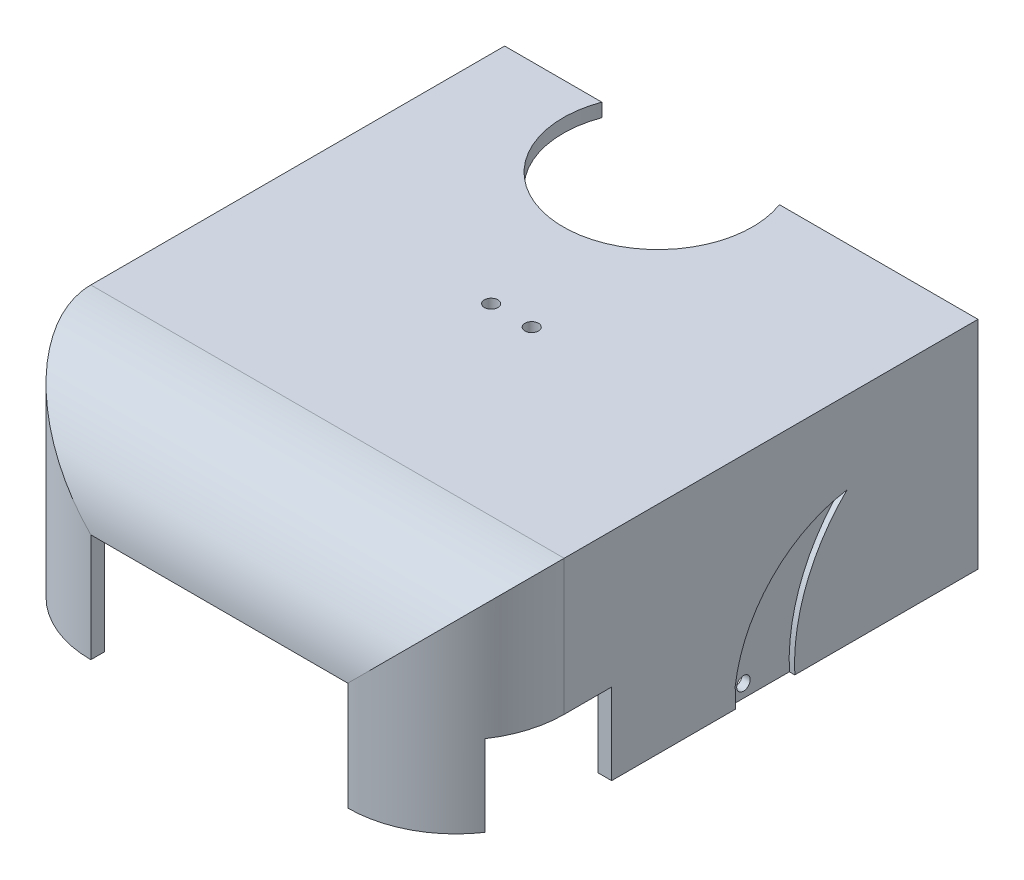
ISO-10303-21;
HEADER;
FILE_DESCRIPTION(('STEP AP214'),'2;1');
FILE_NAME('part.step','',(''),(''),'','','');
FILE_SCHEMA(('AUTOMOTIVE_DESIGN { 1 0 10303 214 1 1 1 1 }'));
ENDSEC;
DATA;
#1=APPLICATION_CONTEXT('core data for automotive mechanical design processes');
#2=APPLICATION_PROTOCOL_DEFINITION('international standard','automotive_design',2000,#1);
#3=PRODUCT_CONTEXT('',#1,'mechanical');
#4=PRODUCT('Part','Part','',(#3));
#5=PRODUCT_RELATED_PRODUCT_CATEGORY('part','',(#4));
#6=PRODUCT_DEFINITION_FORMATION('','',#4);
#7=PRODUCT_DEFINITION_CONTEXT('part definition',#1,'design');
#8=PRODUCT_DEFINITION('design','',#6,#7);
#9=PRODUCT_DEFINITION_SHAPE('','',#8);
#10=(LENGTH_UNIT() NAMED_UNIT(*) SI_UNIT(.MILLI.,.METRE.));
#11=(NAMED_UNIT(*) PLANE_ANGLE_UNIT() SI_UNIT($,.RADIAN.));
#12=(NAMED_UNIT(*) SI_UNIT($,.STERADIAN.) SOLID_ANGLE_UNIT());
#13=UNCERTAINTY_MEASURE_WITH_UNIT(LENGTH_MEASURE(1.E-05),#10,'distance_accuracy_value','');
#14=(GEOMETRIC_REPRESENTATION_CONTEXT(3) GLOBAL_UNCERTAINTY_ASSIGNED_CONTEXT((#13)) GLOBAL_UNIT_ASSIGNED_CONTEXT((#10,
#11,#12)) REPRESENTATION_CONTEXT('',''));
#15=CARTESIAN_POINT('',(0.,0.,0.));
#16=DIRECTION('',(0.,0.,1.));
#17=DIRECTION('',(1.,0.,0.));
#18=AXIS2_PLACEMENT_3D('',#15,#16,#17);
#19=CARTESIAN_POINT('',(87.5,-80.,193.));
#20=DIRECTION('',(-1.,0.,0.));
#21=DIRECTION('',(0.,0.,1.));
#22=AXIS2_PLACEMENT_3D('',#19,#20,#21);
#23=PLANE('',#22);
#24=CARTESIAN_POINT('',(87.5,3.51978458868363,3.39554748014627));
#25=DIRECTION('',(1.,0.,0.));
#26=DIRECTION('',(0.,0.,-1.));
#27=AXIS2_PLACEMENT_3D('',#24,#25,#26);
#28=CIRCLE('',#27,64.4295026280098);
#29=CARTESIAN_POINT('',(87.5,49.5892121244553,48.4374019648253));
#30=VERTEX_POINT('',#29);
#31=CARTESIAN_POINT('',(87.5,0.,67.7288353282113));
#32=VERTEX_POINT('',#31);
#33=EDGE_CURVE('E248',#30,#32,#28,.T.);
#34=ORIENTED_EDGE('',*,*,#33,.T.);
#35=DIRECTION('',(0.,0.,-1.));
#36=VECTOR('',#35,1.);
#37=CARTESIAN_POINT('',(87.5,0.,193.));
#38=LINE('',#37,#36);
#39=CARTESIAN_POINT('',(87.5,0.,0.));
#40=VERTEX_POINT('',#39);
#41=EDGE_CURVE('E356',#32,#40,#38,.T.);
#42=ORIENTED_EDGE('',*,*,#41,.T.);
#43=DIRECTION('',(0.,1.,0.));
#44=VECTOR('',#43,1.);
#45=CARTESIAN_POINT('',(87.5,-80.,0.));
#46=LINE('',#45,#44);
#47=CARTESIAN_POINT('',(87.5,80.,0.));
#48=VERTEX_POINT('',#47);
#49=EDGE_CURVE('E478',#40,#48,#46,.T.);
#50=ORIENTED_EDGE('',*,*,#49,.T.);
#51=DIRECTION('',(0.,0.,-1.));
#52=VECTOR('',#51,1.);
#53=CARTESIAN_POINT('',(87.5,80.,193.));
#54=LINE('',#53,#52);
#55=CARTESIAN_POINT('',(87.5,80.,153.));
#56=VERTEX_POINT('',#55);
#57=EDGE_CURVE('E495',#56,#48,#54,.T.);
#58=ORIENTED_EDGE('',*,*,#57,.F.);
#59=DIRECTION('',(0.,1.,0.));
#60=VECTOR('',#59,1.);
#61=CARTESIAN_POINT('',(87.5,-80.,153.));
#62=LINE('',#61,#60);
#63=CARTESIAN_POINT('',(87.5,30.,153.));
#64=VERTEX_POINT('',#63);
#65=EDGE_CURVE('E510',#56,#64,#62,.F.);
#66=ORIENTED_EDGE('',*,*,#65,.T.);
#67=DIRECTION('',(0.,0.,-1.));
#68=VECTOR('',#67,1.);
#69=CARTESIAN_POINT('',(87.5,30.,193.));
#70=LINE('',#69,#68);
#71=CARTESIAN_POINT('',(87.5,30.,135.457670656423));
#72=VERTEX_POINT('',#71);
#73=EDGE_CURVE('E397',#64,#72,#70,.T.);
#74=ORIENTED_EDGE('',*,*,#73,.T.);
#75=DIRECTION('',(0.,-1.,0.));
#76=VECTOR('',#75,1.);
#77=CARTESIAN_POINT('',(87.5,-80.,135.457670656423));
#78=LINE('',#77,#76);
#79=CARTESIAN_POINT('',(87.5,0.,135.457670656423));
#80=VERTEX_POINT('',#79);
#81=EDGE_CURVE('E405',#72,#80,#78,.T.);
#82=ORIENTED_EDGE('',*,*,#81,.T.);
#83=CARTESIAN_POINT('',(87.5,0.,89.7288353282113));
#84=VERTEX_POINT('',#83);
#85=EDGE_CURVE('E357',#80,#84,#38,.T.);
#86=ORIENTED_EDGE('',*,*,#85,.T.);
#87=DIRECTION('',(0.,0.999043315977412,-0.0437315995689179));
#88=VECTOR('',#87,1.);
#89=CARTESIAN_POINT('',(87.5,0.,89.7288353282113));
#90=LINE('',#89,#88);
#91=CARTESIAN_POINT('',(87.5,2.29557496399044,89.6283500304267));
#92=VERTEX_POINT('',#91);
#93=EDGE_CURVE('E631',#84,#92,#90,.T.);
#94=ORIENTED_EDGE('',*,*,#93,.T.);
#95=DIRECTION('',(0.,-0.999602780590757,-0.0281829919495297));
#96=VECTOR('',#95,1.);
#97=CARTESIAN_POINT('',(87.5,7.29358886694422,89.7692649901744));
#98=LINE('',#97,#96);
#99=CARTESIAN_POINT('',(87.5,7.29358886694422,89.7692649901744));
#100=VERTEX_POINT('',#99);
#101=EDGE_CURVE('E244',#100,#92,#98,.T.);
#102=ORIENTED_EDGE('',*,*,#101,.F.);
#103=CARTESIAN_POINT('',(87.5,0.973763055425838,40.9952163999991));
#104=DIRECTION('',(-1.,0.,0.));
#105=DIRECTION('',(0.,0.,1.));
#106=AXIS2_PLACEMENT_3D('',#103,#104,#105);
#107=CIRCLE('',#106,49.1817853901697);
#108=EDGE_CURVE('E650',#100,#30,#107,.T.);
#109=ORIENTED_EDGE('',*,*,#108,.T.);
#110=EDGE_LOOP('',(#34,#42,#50,#58,#66,#74,#82,#86,#94,#102,#109));
#111=FACE_BOUND('',#110,.T.);
#112=ADVANCED_FACE('F45',(#111),#23,.F.);
#113=CARTESIAN_POINT('',(0.,0.,0.));
#114=DIRECTION('',(0.,1.,0.));
#115=DIRECTION('',(0.,0.,1.));
#116=AXIS2_PLACEMENT_3D('',#113,#114,#115);
#117=PLANE('',#116);
#118=DIRECTION('',(1.,0.,0.));
#119=VECTOR('',#118,1.);
#120=CARTESIAN_POINT('',(85.5,0.,67.7288353282113));
#121=LINE('',#120,#119);
#122=CARTESIAN_POINT('',(85.5,0.,67.7288353282113));
#123=VERTEX_POINT('',#122);
#124=EDGE_CURVE('E251',#123,#32,#121,.T.);
#125=ORIENTED_EDGE('',*,*,#124,.F.);
#126=DIRECTION('',(0.,0.,1.));
#127=VECTOR('',#126,1.);
#128=CARTESIAN_POINT('',(85.5,0.,67.7288353282113));
#129=LINE('',#128,#127);
#130=CARTESIAN_POINT('',(85.5,0.,89.7288353282113));
#131=VERTEX_POINT('',#130);
#132=EDGE_CURVE('E230',#123,#131,#129,.T.);
#133=ORIENTED_EDGE('',*,*,#132,.T.);
#134=DIRECTION('',(1.,0.,0.));
#135=VECTOR('',#134,1.);
#136=CARTESIAN_POINT('',(85.5,0.,89.7288353282113));
#137=LINE('',#136,#135);
#138=EDGE_CURVE('E258',#131,#84,#137,.T.);
#139=ORIENTED_EDGE('',*,*,#138,.T.);
#140=ORIENTED_EDGE('',*,*,#85,.F.);
#141=DIRECTION('',(1.,0.,0.));
#142=VECTOR('',#141,1.);
#143=CARTESIAN_POINT('',(70.,0.,135.457670656423));
#144=LINE('',#143,#142);
#145=CARTESIAN_POINT('',(82.5,0.,135.457670656423));
#146=VERTEX_POINT('',#145);
#147=EDGE_CURVE('E349',#146,#80,#144,.T.);
#148=ORIENTED_EDGE('',*,*,#147,.F.);
#149=DIRECTION('',(0.,0.,-1.));
#150=VECTOR('',#149,1.);
#151=CARTESIAN_POINT('',(82.5,0.,193.));
#152=LINE('',#151,#150);
#153=CARTESIAN_POINT('',(82.5,0.,0.));
#154=VERTEX_POINT('',#153);
#155=EDGE_CURVE('E353',#146,#154,#152,.T.);
#156=ORIENTED_EDGE('',*,*,#155,.T.);
#157=DIRECTION('',(-1.,0.,0.));
#158=VECTOR('',#157,1.);
#159=CARTESIAN_POINT('',(110.,0.,0.));
#160=LINE('',#159,#158);
#161=EDGE_CURVE('E337',#40,#154,#160,.T.);
#162=ORIENTED_EDGE('',*,*,#161,.F.);
#163=ORIENTED_EDGE('',*,*,#41,.F.);
#164=EDGE_LOOP('',(#125,#133,#139,#140,#148,#156,#162,#163));
#165=FACE_BOUND('',#164,.T.);
#166=ADVANCED_FACE('F633',(#165),#117,.F.);
#167=DIRECTION('',(0.,0.,1.));
#168=VECTOR('',#167,1.);
#169=CARTESIAN_POINT('',(-87.5,0.,193.));
#170=LINE('',#169,#168);
#171=CARTESIAN_POINT('',(-87.5,0.,85.));
#172=VERTEX_POINT('',#171);
#173=CARTESIAN_POINT('',(-87.5,0.,153.));
#174=VERTEX_POINT('',#173);
#175=EDGE_CURVE('E378',#172,#174,#170,.T.);
#176=ORIENTED_EDGE('',*,*,#175,.F.);
#177=DIRECTION('',(1.,0.,0.));
#178=VECTOR('',#177,1.);
#179=CARTESIAN_POINT('',(0.,0.,85.));
#180=LINE('',#179,#178);
#181=CARTESIAN_POINT('',(-82.5,0.,85.));
#182=VERTEX_POINT('',#181);
#183=EDGE_CURVE('E11',#172,#182,#180,.T.);
#184=ORIENTED_EDGE('',*,*,#183,.T.);
#185=DIRECTION('',(0.,0.,1.));
#186=VECTOR('',#185,1.);
#187=CARTESIAN_POINT('',(-82.5,0.,193.));
#188=LINE('',#187,#186);
#189=CARTESIAN_POINT('',(-82.5,0.,153.));
#190=VERTEX_POINT('',#189);
#191=EDGE_CURVE('E369',#182,#190,#188,.T.);
#192=ORIENTED_EDGE('',*,*,#191,.T.);
#193=CARTESIAN_POINT('',(-47.5,0.,153.));
#194=DIRECTION('',(0.,1.,0.));
#195=DIRECTION('',(0.,0.,1.));
#196=AXIS2_PLACEMENT_3D('',#193,#194,#195);
#197=CIRCLE('',#196,35.);
#198=CARTESIAN_POINT('',(-47.5,0.,188.));
#199=VERTEX_POINT('',#198);
#200=EDGE_CURVE('E365',#199,#190,#197,.F.);
#201=ORIENTED_EDGE('',*,*,#200,.F.);
#202=DIRECTION('',(0.,0.,-1.));
#203=VECTOR('',#202,1.);
#204=CARTESIAN_POINT('',(-47.5,0.,183.));
#205=LINE('',#204,#203);
#206=CARTESIAN_POINT('',(-47.5,0.,193.));
#207=VERTEX_POINT('',#206);
#208=EDGE_CURVE('E361',#207,#199,#205,.T.);
#209=ORIENTED_EDGE('',*,*,#208,.F.);
#210=CARTESIAN_POINT('',(-47.5,0.,153.));
#211=DIRECTION('',(0.,1.,0.));
#212=DIRECTION('',(0.,0.,1.));
#213=AXIS2_PLACEMENT_3D('',#210,#211,#212);
#214=CIRCLE('',#213,40.);
#215=EDGE_CURVE('E374',#207,#174,#214,.F.);
#216=ORIENTED_EDGE('',*,*,#215,.T.);
#217=EDGE_LOOP('',(#176,#184,#192,#201,#209,#216));
#218=FACE_BOUND('',#217,.T.);
#219=ADVANCED_FACE('F568',(#218),#117,.F.);
#220=CARTESIAN_POINT('',(0.,0.,0.));
#221=DIRECTION('',(0.,0.,-1.));
#222=DIRECTION('',(-1.,0.,0.));
#223=AXIS2_PLACEMENT_3D('',#220,#221,#222);
#224=PLANE('',#223);
#225=CARTESIAN_POINT('',(-82.5,0.,0.));
#226=VERTEX_POINT('',#225);
#227=CARTESIAN_POINT('',(-87.5,0.,0.));
#228=VERTEX_POINT('',#227);
#229=EDGE_CURVE('E322',#226,#228,#160,.T.);
#230=ORIENTED_EDGE('',*,*,#229,.T.);
#231=DIRECTION('',(0.,-1.,0.));
#232=VECTOR('',#231,1.);
#233=CARTESIAN_POINT('',(-87.5,-80.,0.));
#234=LINE('',#233,#232);
#235=CARTESIAN_POINT('',(-87.5,80.,0.));
#236=VERTEX_POINT('',#235);
#237=EDGE_CURVE('E487',#236,#228,#234,.T.);
#238=ORIENTED_EDGE('',*,*,#237,.F.);
#239=DIRECTION('',(-1.,0.,0.));
#240=VECTOR('',#239,1.);
#241=CARTESIAN_POINT('',(-87.5,80.,0.));
#242=LINE('',#241,#240);
#243=CARTESIAN_POINT('',(-51.5907616385491,80.,0.));
#244=VERTEX_POINT('',#243);
#245=EDGE_CURVE('E481',#244,#236,#242,.T.);
#246=ORIENTED_EDGE('',*,*,#245,.F.);
#247=DIRECTION('',(0.,1.,0.));
#248=VECTOR('',#247,1.);
#249=CARTESIAN_POINT('',(-51.5907616385491,-80.,0.));
#250=LINE('',#249,#248);
#251=CARTESIAN_POINT('',(-51.5907616385491,75.,0.));
#252=VERTEX_POINT('',#251);
#253=EDGE_CURVE('E416',#252,#244,#250,.T.);
#254=ORIENTED_EDGE('',*,*,#253,.F.);
#255=DIRECTION('',(-1.,0.,0.));
#256=VECTOR('',#255,1.);
#257=CARTESIAN_POINT('',(0.,75.,0.));
#258=LINE('',#257,#256);
#259=CARTESIAN_POINT('',(-82.5,75.,0.));
#260=VERTEX_POINT('',#259);
#261=EDGE_CURVE('E470',#252,#260,#258,.T.);
#262=ORIENTED_EDGE('',*,*,#261,.T.);
#263=DIRECTION('',(0.,-1.,0.));
#264=VECTOR('',#263,1.);
#265=CARTESIAN_POINT('',(-82.5,0.,0.));
#266=LINE('',#265,#264);
#267=EDGE_CURVE('E444',#260,#226,#266,.T.);
#268=ORIENTED_EDGE('',*,*,#267,.T.);
#269=EDGE_LOOP('',(#230,#238,#246,#254,#262,#268));
#270=FACE_BOUND('',#269,.T.);
#271=ADVANCED_FACE('F553',(#270),#224,.T.);
#272=ORIENTED_EDGE('',*,*,#161,.T.);
#273=DIRECTION('',(0.,1.,0.));
#274=VECTOR('',#273,1.);
#275=CARTESIAN_POINT('',(82.5,0.,0.));
#276=LINE('',#275,#274);
#277=CARTESIAN_POINT('',(82.5,75.,0.));
#278=VERTEX_POINT('',#277);
#279=EDGE_CURVE('E455',#154,#278,#276,.T.);
#280=ORIENTED_EDGE('',*,*,#279,.T.);
#281=CARTESIAN_POINT('',(14.0907616385492,75.,0.));
#282=VERTEX_POINT('',#281);
#283=EDGE_CURVE('E474',#278,#282,#258,.T.);
#284=ORIENTED_EDGE('',*,*,#283,.T.);
#285=DIRECTION('',(0.,1.,0.));
#286=VECTOR('',#285,1.);
#287=CARTESIAN_POINT('',(14.0907616385492,-80.,0.));
#288=LINE('',#287,#286);
#289=CARTESIAN_POINT('',(14.0907616385492,80.,0.));
#290=VERTEX_POINT('',#289);
#291=EDGE_CURVE('E413',#290,#282,#288,.F.);
#292=ORIENTED_EDGE('',*,*,#291,.F.);
#293=EDGE_CURVE('E483',#48,#290,#242,.T.);
#294=ORIENTED_EDGE('',*,*,#293,.F.);
#295=ORIENTED_EDGE('',*,*,#49,.F.);
#296=EDGE_LOOP('',(#272,#280,#284,#292,#294,#295));
#297=FACE_BOUND('',#296,.T.);
#298=ADVANCED_FACE('F581',(#297),#224,.T.);
#299=CARTESIAN_POINT('',(-87.5,80.,193.));
#300=DIRECTION('',(0.,-1.,0.));
#301=DIRECTION('',(0.,0.,-1.));
#302=AXIS2_PLACEMENT_3D('',#299,#300,#301);
#303=PLANE('',#302);
#304=CARTESIAN_POINT('',(7.5,80.,85.));
#305=DIRECTION('',(0.,1.,0.));
#306=DIRECTION('',(0.,0.,1.));
#307=AXIS2_PLACEMENT_3D('',#304,#305,#306);
#308=CIRCLE('',#307,2.5);
#309=CARTESIAN_POINT('',(7.5,80.,87.5));
#310=VERTEX_POINT('',#309);
#311=EDGE_CURVE('E323',#310,#310,#308,.T.);
#312=ORIENTED_EDGE('',*,*,#311,.F.);
#313=EDGE_LOOP('',(#312));
#314=FACE_BOUND('',#313,.T.);
#315=CARTESIAN_POINT('',(-7.5,80.,85.));
#316=DIRECTION('',(0.,1.,0.));
#317=DIRECTION('',(0.,0.,1.));
#318=AXIS2_PLACEMENT_3D('',#315,#316,#317);
#319=CIRCLE('',#318,2.5);
#320=CARTESIAN_POINT('',(-7.5,80.,87.5));
#321=VERTEX_POINT('',#320);
#322=EDGE_CURVE('E327',#321,#321,#319,.T.);
#323=ORIENTED_EDGE('',*,*,#322,.F.);
#324=EDGE_LOOP('',(#323));
#325=FACE_BOUND('',#324,.T.);
#326=ORIENTED_EDGE('',*,*,#293,.T.);
#327=CARTESIAN_POINT('',(-18.75,80.,12.1030729568982));
#328=DIRECTION('',(0.,1.,0.));
#329=DIRECTION('',(0.,0.,1.));
#330=AXIS2_PLACEMENT_3D('',#327,#328,#329);
#331=CIRCLE('',#330,35.);
#332=EDGE_CURVE('E409',#244,#290,#331,.T.);
#333=ORIENTED_EDGE('',*,*,#332,.F.);
#334=ORIENTED_EDGE('',*,*,#245,.T.);
#335=DIRECTION('',(0.,0.,-1.));
#336=VECTOR('',#335,1.);
#337=CARTESIAN_POINT('',(-87.5,80.,193.));
#338=LINE('',#337,#336);
#339=CARTESIAN_POINT('',(-87.5,80.,153.));
#340=VERTEX_POINT('',#339);
#341=EDGE_CURVE('E491',#340,#236,#338,.T.);
#342=ORIENTED_EDGE('',*,*,#341,.F.);
#343=DIRECTION('',(-1.,0.,0.));
#344=VECTOR('',#343,1.);
#345=CARTESIAN_POINT('',(-87.5,80.,153.));
#346=LINE('',#345,#344);
#347=EDGE_CURVE('E514',#340,#56,#346,.F.);
#348=ORIENTED_EDGE('',*,*,#347,.T.);
#349=ORIENTED_EDGE('',*,*,#57,.T.);
#350=EDGE_LOOP('',(#326,#333,#334,#342,#348,#349));
#351=FACE_BOUND('',#350,.T.);
#352=ADVANCED_FACE('F603',(#314,#325,#351),#303,.F.);
#353=CARTESIAN_POINT('',(-87.5,-80.,193.));
#354=DIRECTION('',(1.,0.,0.));
#355=DIRECTION('',(0.,0.,-1.));
#356=AXIS2_PLACEMENT_3D('',#353,#354,#355);
#357=PLANE('',#356);
#358=CARTESIAN_POINT('',(-87.5,40.,130.));
#359=DIRECTION('',(-1.,0.,0.));
#360=DIRECTION('',(0.,0.,1.));
#361=AXIS2_PLACEMENT_3D('',#358,#359,#360);
#362=CIRCLE('',#361,2.5);
#363=CARTESIAN_POINT('',(-87.5,40.,132.5));
#364=VERTEX_POINT('',#363);
#365=EDGE_CURVE('E279',#364,#364,#362,.T.);
#366=ORIENTED_EDGE('',*,*,#365,.F.);
#367=EDGE_LOOP('',(#366));
#368=FACE_BOUND('',#367,.T.);
#369=CARTESIAN_POINT('',(-87.5,40.,142.5));
#370=DIRECTION('',(-1.,0.,0.));
#371=DIRECTION('',(0.,0.,1.));
#372=AXIS2_PLACEMENT_3D('',#369,#370,#371);
#373=CIRCLE('',#372,2.5);
#374=CARTESIAN_POINT('',(-87.5,40.,145.));
#375=VERTEX_POINT('',#374);
#376=EDGE_CURVE('E299',#375,#375,#373,.T.);
#377=ORIENTED_EDGE('',*,*,#376,.F.);
#378=EDGE_LOOP('',(#377));
#379=FACE_BOUND('',#378,.T.);
#380=CARTESIAN_POINT('',(-87.5,25.,70.));
#381=DIRECTION('',(-1.,0.,0.));
#382=DIRECTION('',(0.,0.,1.));
#383=AXIS2_PLACEMENT_3D('',#380,#381,#382);
#384=CIRCLE('',#383,2.5);
#385=CARTESIAN_POINT('',(-87.5,25.,72.5));
#386=VERTEX_POINT('',#385);
#387=EDGE_CURVE('E307',#386,#386,#384,.T.);
#388=ORIENTED_EDGE('',*,*,#387,.F.);
#389=EDGE_LOOP('',(#388));
#390=FACE_BOUND('',#389,.T.);
#391=CARTESIAN_POINT('',(-87.5,25.,95.));
#392=DIRECTION('',(-1.,0.,0.));
#393=DIRECTION('',(0.,0.,1.));
#394=AXIS2_PLACEMENT_3D('',#391,#392,#393);
#395=CIRCLE('',#394,2.50000000000001);
#396=CARTESIAN_POINT('',(-87.5,25.,97.5));
#397=VERTEX_POINT('',#396);
#398=EDGE_CURVE('E256',#397,#397,#395,.T.);
#399=ORIENTED_EDGE('',*,*,#398,.F.);
#400=EDGE_LOOP('',(#399));
#401=FACE_BOUND('',#400,.T.);
#402=DIRECTION('',(0.,0.,-1.));
#403=VECTOR('',#402,1.);
#404=CARTESIAN_POINT('',(-87.5,20.,85.));
#405=LINE('',#404,#403);
#406=CARTESIAN_POINT('',(-87.5,20.,85.));
#407=VERTEX_POINT('',#406);
#408=CARTESIAN_POINT('',(-87.5,20.,65.));
#409=VERTEX_POINT('',#408);
#410=EDGE_CURVE('E267',#407,#409,#405,.T.);
#411=ORIENTED_EDGE('',*,*,#410,.F.);
#412=DIRECTION('',(0.,1.,0.));
#413=VECTOR('',#412,1.);
#414=CARTESIAN_POINT('',(-87.5,-10.,85.));
#415=LINE('',#414,#413);
#416=EDGE_CURVE('E278',#172,#407,#415,.T.);
#417=ORIENTED_EDGE('',*,*,#416,.F.);
#418=ORIENTED_EDGE('',*,*,#175,.T.);
#419=DIRECTION('',(0.,-1.,0.));
#420=VECTOR('',#419,1.);
#421=CARTESIAN_POINT('',(-87.5,-80.,153.));
#422=LINE('',#421,#420);
#423=EDGE_CURVE('E517',#174,#340,#422,.F.);
#424=ORIENTED_EDGE('',*,*,#423,.T.);
#425=ORIENTED_EDGE('',*,*,#341,.T.);
#426=ORIENTED_EDGE('',*,*,#237,.T.);
#427=CARTESIAN_POINT('',(-87.5,0.,65.));
#428=VERTEX_POINT('',#427);
#429=EDGE_CURVE('E379',#228,#428,#170,.T.);
#430=ORIENTED_EDGE('',*,*,#429,.T.);
#431=DIRECTION('',(0.,-1.,0.));
#432=VECTOR('',#431,1.);
#433=CARTESIAN_POINT('',(-87.5,0.,65.));
#434=LINE('',#433,#432);
#435=EDGE_CURVE('E69',#409,#428,#434,.T.);
#436=ORIENTED_EDGE('',*,*,#435,.F.);
#437=EDGE_LOOP('',(#411,#417,#418,#424,#425,#426,#430,#436));
#438=FACE_BOUND('',#437,.T.);
#439=ADVANCED_FACE('F548',(#368,#379,#390,#401,#438),#357,.F.);
#440=CARTESIAN_POINT('',(0.,40.,153.));
#441=DIRECTION('',(-1.,0.,0.));
#442=DIRECTION('',(0.,0.,1.));
#443=AXIS2_PLACEMENT_3D('',#440,#441,#442);
#444=CYLINDRICAL_SURFACE('',#443,40.);
#445=CARTESIAN_POINT('',(47.5,40.,153.));
#446=DIRECTION('',(-0.707106781186547,0.707106781186547,0.));
#447=DIRECTION('',(-0.707106781186547,-0.707106781186547,0.));
#448=AXIS2_PLACEMENT_3D('',#445,#446,#447);
#449=ELLIPSE('',#448,56.5685424949238,40.);
#450=CARTESIAN_POINT('',(47.5,40.,193.));
#451=VERTEX_POINT('',#450);
#452=EDGE_CURVE('E450',#56,#451,#449,.F.);
#453=ORIENTED_EDGE('',*,*,#452,.F.);
#454=ORIENTED_EDGE('',*,*,#347,.F.);
#455=CARTESIAN_POINT('',(-47.5,40.,153.));
#456=DIRECTION('',(-0.707106781186547,-0.707106781186547,0.));
#457=DIRECTION('',(0.707106781186547,-0.707106781186547,0.));
#458=AXIS2_PLACEMENT_3D('',#455,#456,#457);
#459=ELLIPSE('',#458,56.5685424949238,40.);
#460=CARTESIAN_POINT('',(-47.5,40.,193.));
#461=VERTEX_POINT('',#460);
#462=EDGE_CURVE('E482',#461,#340,#459,.T.);
#463=ORIENTED_EDGE('',*,*,#462,.F.);
#464=DIRECTION('',(-1.,0.,0.));
#465=VECTOR('',#464,1.);
#466=CARTESIAN_POINT('',(0.,40.,193.));
#467=LINE('',#466,#465);
#468=EDGE_CURVE('E503',#451,#461,#467,.T.);
#469=ORIENTED_EDGE('',*,*,#468,.F.);
#470=EDGE_LOOP('',(#453,#454,#463,#469));
#471=FACE_BOUND('',#470,.T.);
#472=ADVANCED_FACE('F47',(#471),#444,.T.);
#473=CARTESIAN_POINT('',(-47.5,0.,153.));
#474=DIRECTION('',(0.,-1.,0.));
#475=DIRECTION('',(0.,0.,-1.));
#476=AXIS2_PLACEMENT_3D('',#473,#474,#475);
#477=CYLINDRICAL_SURFACE('',#476,40.);
#478=ORIENTED_EDGE('',*,*,#215,.F.);
#479=DIRECTION('',(0.,-1.,0.));
#480=VECTOR('',#479,1.);
#481=CARTESIAN_POINT('',(-47.5,0.,193.));
#482=LINE('',#481,#480);
#483=EDGE_CURVE('E499',#461,#207,#482,.T.);
#484=ORIENTED_EDGE('',*,*,#483,.F.);
#485=ORIENTED_EDGE('',*,*,#462,.T.);
#486=ORIENTED_EDGE('',*,*,#423,.F.);
#487=EDGE_LOOP('',(#478,#484,#485,#486));
#488=FACE_BOUND('',#487,.T.);
#489=ADVANCED_FACE('F694',(#488),#477,.T.);
#490=CARTESIAN_POINT('',(47.5,0.,153.));
#491=DIRECTION('',(0.,1.,0.));
#492=DIRECTION('',(0.,0.,1.));
#493=AXIS2_PLACEMENT_3D('',#490,#491,#492);
#494=CYLINDRICAL_SURFACE('',#493,40.);
#495=CARTESIAN_POINT('',(47.5,0.,153.));
#496=DIRECTION('',(0.,1.,0.));
#497=DIRECTION('',(0.,0.,1.));
#498=AXIS2_PLACEMENT_3D('',#495,#496,#497);
#499=CIRCLE('',#498,40.);
#500=CARTESIAN_POINT('',(80.6006499737944,0.,175.457670656423));
#501=VERTEX_POINT('',#500);
#502=CARTESIAN_POINT('',(47.5,0.,193.));
#503=VERTEX_POINT('',#502);
#504=EDGE_CURVE('E342',#501,#503,#499,.F.);
#505=ORIENTED_EDGE('',*,*,#504,.F.);
#506=DIRECTION('',(0.,1.,0.));
#507=VECTOR('',#506,1.);
#508=CARTESIAN_POINT('',(80.6006499737944,0.,175.457670656423));
#509=LINE('',#508,#507);
#510=CARTESIAN_POINT('',(80.6006499737944,30.,175.457670656423));
#511=VERTEX_POINT('',#510);
#512=EDGE_CURVE('E401',#511,#501,#509,.F.);
#513=ORIENTED_EDGE('',*,*,#512,.F.);
#514=CARTESIAN_POINT('',(47.5,30.,153.));
#515=DIRECTION('',(0.,1.,0.));
#516=DIRECTION('',(0.,0.,1.));
#517=AXIS2_PLACEMENT_3D('',#514,#515,#516);
#518=CIRCLE('',#517,40.);
#519=EDGE_CURVE('E394',#64,#511,#518,.F.);
#520=ORIENTED_EDGE('',*,*,#519,.F.);
#521=ORIENTED_EDGE('',*,*,#65,.F.);
#522=ORIENTED_EDGE('',*,*,#452,.T.);
#523=DIRECTION('',(0.,1.,0.));
#524=VECTOR('',#523,1.);
#525=CARTESIAN_POINT('',(47.5,0.,193.));
#526=LINE('',#525,#524);
#527=EDGE_CURVE('E507',#503,#451,#526,.T.);
#528=ORIENTED_EDGE('',*,*,#527,.F.);
#529=EDGE_LOOP('',(#505,#513,#520,#521,#522,#528));
#530=FACE_BOUND('',#529,.T.);
#531=ADVANCED_FACE('F616',(#530),#494,.T.);
#532=CARTESIAN_POINT('',(82.5,-80.,193.));
#533=DIRECTION('',(-1.,0.,0.));
#534=DIRECTION('',(0.,0.,1.));
#535=AXIS2_PLACEMENT_3D('',#532,#533,#534);
#536=PLANE('',#535);
#537=CARTESIAN_POINT('',(82.5,4.79458191546733,84.6988075103005));
#538=DIRECTION('',(-1.,0.,0.));
#539=DIRECTION('',(0.,0.,1.));
#540=AXIS2_PLACEMENT_3D('',#537,#538,#539);
#541=CIRCLE('',#540,2.5);
#542=CARTESIAN_POINT('',(82.5,4.79458191546733,87.1988075103005));
#543=VERTEX_POINT('',#542);
#544=EDGE_CURVE('E653',#543,#543,#541,.T.);
#545=ORIENTED_EDGE('',*,*,#544,.F.);
#546=EDGE_LOOP('',(#545));
#547=FACE_BOUND('',#546,.T.);
#548=ORIENTED_EDGE('',*,*,#155,.F.);
#549=DIRECTION('',(0.,-1.,0.));
#550=VECTOR('',#549,1.);
#551=CARTESIAN_POINT('',(82.5,-80.,135.457670656423));
#552=LINE('',#551,#550);
#553=CARTESIAN_POINT('',(82.5,30.,135.457670656423));
#554=VERTEX_POINT('',#553);
#555=EDGE_CURVE('E534',#554,#146,#552,.T.);
#556=ORIENTED_EDGE('',*,*,#555,.F.);
#557=DIRECTION('',(0.,0.,-1.));
#558=VECTOR('',#557,1.);
#559=CARTESIAN_POINT('',(82.5,30.,193.));
#560=LINE('',#559,#558);
#561=CARTESIAN_POINT('',(82.5,30.,153.));
#562=VERTEX_POINT('',#561);
#563=EDGE_CURVE('E388',#562,#554,#560,.T.);
#564=ORIENTED_EDGE('',*,*,#563,.F.);
#565=DIRECTION('',(0.,1.,0.));
#566=VECTOR('',#565,1.);
#567=CARTESIAN_POINT('',(82.5,-80.,153.));
#568=LINE('',#567,#566);
#569=CARTESIAN_POINT('',(82.5,75.,153.));
#570=VERTEX_POINT('',#569);
#571=EDGE_CURVE('E435',#570,#562,#568,.F.);
#572=ORIENTED_EDGE('',*,*,#571,.F.);
#573=DIRECTION('',(0.,0.,-1.));
#574=VECTOR('',#573,1.);
#575=CARTESIAN_POINT('',(82.5,75.,193.));
#576=LINE('',#575,#574);
#577=EDGE_CURVE('E429',#570,#278,#576,.T.);
#578=ORIENTED_EDGE('',*,*,#577,.T.);
#579=ORIENTED_EDGE('',*,*,#279,.F.);
#580=EDGE_LOOP('',(#548,#556,#564,#572,#578,#579));
#581=FACE_BOUND('',#580,.T.);
#582=ADVANCED_FACE('F587',(#547,#581),#536,.T.);
#583=CARTESIAN_POINT('',(-87.5,75.,193.));
#584=DIRECTION('',(0.,-1.,0.));
#585=DIRECTION('',(0.,0.,-1.));
#586=AXIS2_PLACEMENT_3D('',#583,#584,#585);
#587=PLANE('',#586);
#588=CARTESIAN_POINT('',(7.5,75.,85.));
#589=DIRECTION('',(0.,1.,0.));
#590=DIRECTION('',(0.,0.,1.));
#591=AXIS2_PLACEMENT_3D('',#588,#589,#590);
#592=CIRCLE('',#591,2.5);
#593=CARTESIAN_POINT('',(7.5,75.,87.5));
#594=VERTEX_POINT('',#593);
#595=EDGE_CURVE('E318',#594,#594,#592,.T.);
#596=ORIENTED_EDGE('',*,*,#595,.T.);
#597=EDGE_LOOP('',(#596));
#598=FACE_BOUND('',#597,.T.);
#599=CARTESIAN_POINT('',(-7.5,75.,85.));
#600=DIRECTION('',(0.,1.,0.));
#601=DIRECTION('',(0.,0.,1.));
#602=AXIS2_PLACEMENT_3D('',#599,#600,#601);
#603=CIRCLE('',#602,2.5);
#604=CARTESIAN_POINT('',(-7.5,75.,87.5));
#605=VERTEX_POINT('',#604);
#606=EDGE_CURVE('E288',#605,#605,#603,.T.);
#607=ORIENTED_EDGE('',*,*,#606,.T.);
#608=EDGE_LOOP('',(#607));
#609=FACE_BOUND('',#608,.T.);
#610=CARTESIAN_POINT('',(-18.75,75.,12.1030729568982));
#611=DIRECTION('',(0.,-1.,0.));
#612=DIRECTION('',(0.,0.,-1.));
#613=AXIS2_PLACEMENT_3D('',#610,#611,#612);
#614=CIRCLE('',#613,35.);
#615=EDGE_CURVE('E412',#282,#252,#614,.T.);
#616=ORIENTED_EDGE('',*,*,#615,.F.);
#617=ORIENTED_EDGE('',*,*,#283,.F.);
#618=ORIENTED_EDGE('',*,*,#577,.F.);
#619=DIRECTION('',(1.,0.,0.));
#620=VECTOR('',#619,1.);
#621=CARTESIAN_POINT('',(-87.5,75.,153.));
#622=LINE('',#621,#620);
#623=CARTESIAN_POINT('',(-82.5,75.,153.));
#624=VERTEX_POINT('',#623);
#625=EDGE_CURVE('E439',#624,#570,#622,.T.);
#626=ORIENTED_EDGE('',*,*,#625,.F.);
#627=DIRECTION('',(0.,0.,-1.));
#628=VECTOR('',#627,1.);
#629=CARTESIAN_POINT('',(-82.5,75.,193.));
#630=LINE('',#629,#628);
#631=EDGE_CURVE('E434',#624,#260,#630,.T.);
#632=ORIENTED_EDGE('',*,*,#631,.T.);
#633=ORIENTED_EDGE('',*,*,#261,.F.);
#634=EDGE_LOOP('',(#616,#617,#618,#626,#632,#633));
#635=FACE_BOUND('',#634,.T.);
#636=ADVANCED_FACE('F597',(#598,#609,#635),#587,.T.);
#637=CARTESIAN_POINT('',(-82.5,-80.,193.));
#638=DIRECTION('',(1.,0.,0.));
#639=DIRECTION('',(0.,0.,-1.));
#640=AXIS2_PLACEMENT_3D('',#637,#638,#639);
#641=PLANE('',#640);
#642=DIRECTION('',(0.,1.,0.));
#643=VECTOR('',#642,1.);
#644=CARTESIAN_POINT('',(-82.5,-10.,85.));
#645=LINE('',#644,#643);
#646=CARTESIAN_POINT('',(-82.5,20.,85.));
#647=VERTEX_POINT('',#646);
#648=EDGE_CURVE('E266',#182,#647,#645,.T.);
#649=ORIENTED_EDGE('',*,*,#648,.T.);
#650=DIRECTION('',(0.,0.,-1.));
#651=VECTOR('',#650,1.);
#652=CARTESIAN_POINT('',(-82.5,20.,85.));
#653=LINE('',#652,#651);
#654=CARTESIAN_POINT('',(-82.5,20.,65.));
#655=VERTEX_POINT('',#654);
#656=EDGE_CURVE('E271',#647,#655,#653,.T.);
#657=ORIENTED_EDGE('',*,*,#656,.T.);
#658=DIRECTION('',(0.,-1.,0.));
#659=VECTOR('',#658,1.);
#660=CARTESIAN_POINT('',(-82.5,20.,65.));
#661=LINE('',#660,#659);
#662=CARTESIAN_POINT('',(-82.5,0.,65.));
#663=VERTEX_POINT('',#662);
#664=EDGE_CURVE('E262',#655,#663,#661,.T.);
#665=ORIENTED_EDGE('',*,*,#664,.T.);
#666=EDGE_CURVE('E370',#226,#663,#188,.T.);
#667=ORIENTED_EDGE('',*,*,#666,.F.);
#668=ORIENTED_EDGE('',*,*,#267,.F.);
#669=ORIENTED_EDGE('',*,*,#631,.F.);
#670=DIRECTION('',(0.,1.,0.));
#671=VECTOR('',#670,1.);
#672=CARTESIAN_POINT('',(-82.5,-80.,153.));
#673=LINE('',#672,#671);
#674=EDGE_CURVE('E447',#190,#624,#673,.T.);
#675=ORIENTED_EDGE('',*,*,#674,.F.);
#676=ORIENTED_EDGE('',*,*,#191,.F.);
#677=EDGE_LOOP('',(#649,#657,#665,#667,#668,#669,#675,#676));
#678=FACE_BOUND('',#677,.T.);
#679=CARTESIAN_POINT('',(-82.5,40.,130.));
#680=DIRECTION('',(-1.,0.,0.));
#681=DIRECTION('',(0.,0.,1.));
#682=AXIS2_PLACEMENT_3D('',#679,#680,#681);
#683=CIRCLE('',#682,2.5);
#684=CARTESIAN_POINT('',(-82.5,40.,132.5));
#685=VERTEX_POINT('',#684);
#686=EDGE_CURVE('E295',#685,#685,#683,.T.);
#687=ORIENTED_EDGE('',*,*,#686,.T.);
#688=EDGE_LOOP('',(#687));
#689=FACE_BOUND('',#688,.T.);
#690=CARTESIAN_POINT('',(-82.5,40.,142.5));
#691=DIRECTION('',(-1.,0.,0.));
#692=DIRECTION('',(0.,0.,1.));
#693=AXIS2_PLACEMENT_3D('',#690,#691,#692);
#694=CIRCLE('',#693,2.5);
#695=CARTESIAN_POINT('',(-82.5,40.,145.));
#696=VERTEX_POINT('',#695);
#697=EDGE_CURVE('E303',#696,#696,#694,.T.);
#698=ORIENTED_EDGE('',*,*,#697,.T.);
#699=EDGE_LOOP('',(#698));
#700=FACE_BOUND('',#699,.T.);
#701=CARTESIAN_POINT('',(-82.5,25.,70.));
#702=DIRECTION('',(-1.,0.,0.));
#703=DIRECTION('',(0.,0.,1.));
#704=AXIS2_PLACEMENT_3D('',#701,#702,#703);
#705=CIRCLE('',#704,2.5);
#706=CARTESIAN_POINT('',(-82.5,25.,72.5));
#707=VERTEX_POINT('',#706);
#708=EDGE_CURVE('E311',#707,#707,#705,.T.);
#709=ORIENTED_EDGE('',*,*,#708,.T.);
#710=EDGE_LOOP('',(#709));
#711=FACE_BOUND('',#710,.T.);
#712=CARTESIAN_POINT('',(-82.5,25.,95.));
#713=DIRECTION('',(-1.,0.,0.));
#714=DIRECTION('',(0.,0.,1.));
#715=AXIS2_PLACEMENT_3D('',#712,#713,#714);
#716=CIRCLE('',#715,2.50000000000001);
#717=CARTESIAN_POINT('',(-82.5,25.,97.5));
#718=VERTEX_POINT('',#717);
#719=EDGE_CURVE('E250',#718,#718,#716,.T.);
#720=ORIENTED_EDGE('',*,*,#719,.T.);
#721=EDGE_LOOP('',(#720));
#722=FACE_BOUND('',#721,.T.);
#723=ADVANCED_FACE('F557',(#678,#689,#700,#711,#722),#641,.T.);
#724=CARTESIAN_POINT('',(0.,40.,153.));
#725=DIRECTION('',(-1.,0.,0.));
#726=DIRECTION('',(0.,0.,1.));
#727=AXIS2_PLACEMENT_3D('',#724,#725,#726);
#728=CYLINDRICAL_SURFACE('',#727,35.);
#729=CARTESIAN_POINT('',(47.5,40.,153.));
#730=DIRECTION('',(-0.707106781186547,0.707106781186547,0.));
#731=DIRECTION('',(0.707106781186547,0.707106781186547,0.));
#732=AXIS2_PLACEMENT_3D('',#729,#730,#731);
#733=ELLIPSE('',#732,49.4974746830583,35.);
#734=CARTESIAN_POINT('',(47.5,40.,188.));
#735=VERTEX_POINT('',#734);
#736=EDGE_CURVE('E425',#570,#735,#733,.F.);
#737=ORIENTED_EDGE('',*,*,#736,.T.);
#738=DIRECTION('',(-1.,0.,0.));
#739=VECTOR('',#738,1.);
#740=CARTESIAN_POINT('',(0.,40.,188.));
#741=LINE('',#740,#739);
#742=CARTESIAN_POINT('',(-47.5,40.,188.));
#743=VERTEX_POINT('',#742);
#744=EDGE_CURVE('E459',#735,#743,#741,.T.);
#745=ORIENTED_EDGE('',*,*,#744,.T.);
#746=CARTESIAN_POINT('',(-47.5,40.,153.));
#747=DIRECTION('',(-0.707106781186547,-0.707106781186547,0.));
#748=DIRECTION('',(0.707106781186547,-0.707106781186547,0.));
#749=AXIS2_PLACEMENT_3D('',#746,#747,#748);
#750=ELLIPSE('',#749,49.4974746830583,35.);
#751=EDGE_CURVE('E451',#743,#624,#750,.T.);
#752=ORIENTED_EDGE('',*,*,#751,.T.);
#753=ORIENTED_EDGE('',*,*,#625,.T.);
#754=EDGE_LOOP('',(#737,#745,#752,#753));
#755=FACE_BOUND('',#754,.T.);
#756=ADVANCED_FACE('F712',(#755),#728,.F.);
#757=CARTESIAN_POINT('',(-47.5,0.,153.));
#758=DIRECTION('',(0.,-1.,0.));
#759=DIRECTION('',(0.,0.,-1.));
#760=AXIS2_PLACEMENT_3D('',#757,#758,#759);
#761=CYLINDRICAL_SURFACE('',#760,35.);
#762=DIRECTION('',(0.,1.,0.));
#763=VECTOR('',#762,1.);
#764=CARTESIAN_POINT('',(-47.5,0.,188.));
#765=LINE('',#764,#763);
#766=EDGE_CURVE('E433',#743,#199,#765,.F.);
#767=ORIENTED_EDGE('',*,*,#766,.T.);
#768=ORIENTED_EDGE('',*,*,#200,.T.);
#769=ORIENTED_EDGE('',*,*,#674,.T.);
#770=ORIENTED_EDGE('',*,*,#751,.F.);
#771=EDGE_LOOP('',(#767,#768,#769,#770));
#772=FACE_BOUND('',#771,.T.);
#773=ADVANCED_FACE('F716',(#772),#761,.F.);
#774=CARTESIAN_POINT('',(47.5,0.,153.));
#775=DIRECTION('',(0.,1.,0.));
#776=DIRECTION('',(0.,0.,1.));
#777=AXIS2_PLACEMENT_3D('',#774,#775,#776);
#778=CYLINDRICAL_SURFACE('',#777,35.);
#779=DIRECTION('',(0.,1.,0.));
#780=VECTOR('',#779,1.);
#781=CARTESIAN_POINT('',(74.3449814432355,0.,175.457670656423));
#782=LINE('',#781,#780);
#783=CARTESIAN_POINT('',(74.3449814432355,30.,175.457670656423));
#784=VERTEX_POINT('',#783);
#785=CARTESIAN_POINT('',(74.3449814432355,0.,175.457670656423));
#786=VERTEX_POINT('',#785);
#787=EDGE_CURVE('E520',#784,#786,#782,.F.);
#788=ORIENTED_EDGE('',*,*,#787,.T.);
#789=CARTESIAN_POINT('',(47.5,0.,153.));
#790=DIRECTION('',(0.,1.,0.));
#791=DIRECTION('',(0.,0.,1.));
#792=AXIS2_PLACEMENT_3D('',#789,#790,#791);
#793=CIRCLE('',#792,35.);
#794=CARTESIAN_POINT('',(47.5,0.,188.));
#795=VERTEX_POINT('',#794);
#796=EDGE_CURVE('E338',#786,#795,#793,.F.);
#797=ORIENTED_EDGE('',*,*,#796,.T.);
#798=DIRECTION('',(0.,1.,0.));
#799=VECTOR('',#798,1.);
#800=CARTESIAN_POINT('',(47.5,0.,188.));
#801=LINE('',#800,#799);
#802=EDGE_CURVE('E440',#795,#735,#801,.T.);
#803=ORIENTED_EDGE('',*,*,#802,.T.);
#804=ORIENTED_EDGE('',*,*,#736,.F.);
#805=ORIENTED_EDGE('',*,*,#571,.T.);
#806=CARTESIAN_POINT('',(47.5,30.,153.));
#807=DIRECTION('',(0.,1.,0.));
#808=DIRECTION('',(0.,0.,1.));
#809=AXIS2_PLACEMENT_3D('',#806,#807,#808);
#810=CIRCLE('',#809,35.);
#811=EDGE_CURVE('E530',#562,#784,#810,.F.);
#812=ORIENTED_EDGE('',*,*,#811,.T.);
#813=EDGE_LOOP('',(#788,#797,#803,#804,#805,#812));
#814=FACE_BOUND('',#813,.T.);
#815=ADVANCED_FACE('F624',(#814),#778,.F.);
#816=CARTESIAN_POINT('',(-47.5,40.,183.));
#817=DIRECTION('',(0.,1.,0.));
#818=DIRECTION('',(0.,0.,1.));
#819=AXIS2_PLACEMENT_3D('',#816,#817,#818);
#820=PLANE('',#819);
#821=DIRECTION('',(0.,0.,1.));
#822=VECTOR('',#821,1.);
#823=CARTESIAN_POINT('',(47.5,40.,183.));
#824=LINE('',#823,#822);
#825=EDGE_CURVE('E419',#735,#451,#824,.T.);
#826=ORIENTED_EDGE('',*,*,#825,.T.);
#827=ORIENTED_EDGE('',*,*,#468,.T.);
#828=DIRECTION('',(0.,0.,1.));
#829=VECTOR('',#828,1.);
#830=CARTESIAN_POINT('',(-47.5,40.,183.));
#831=LINE('',#830,#829);
#832=EDGE_CURVE('E422',#743,#461,#831,.T.);
#833=ORIENTED_EDGE('',*,*,#832,.F.);
#834=ORIENTED_EDGE('',*,*,#744,.F.);
#835=EDGE_LOOP('',(#826,#827,#833,#834));
#836=FACE_BOUND('',#835,.T.);
#837=ADVANCED_FACE('F707',(#836),#820,.F.);
#838=CARTESIAN_POINT('',(-47.5,40.,183.));
#839=DIRECTION('',(-1.,0.,0.));
#840=DIRECTION('',(0.,-1.,0.));
#841=AXIS2_PLACEMENT_3D('',#838,#839,#840);
#842=PLANE('',#841);
#843=ORIENTED_EDGE('',*,*,#483,.T.);
#844=ORIENTED_EDGE('',*,*,#208,.T.);
#845=ORIENTED_EDGE('',*,*,#766,.F.);
#846=ORIENTED_EDGE('',*,*,#832,.T.);
#847=EDGE_LOOP('',(#843,#844,#845,#846));
#848=FACE_BOUND('',#847,.T.);
#849=ADVANCED_FACE('F703',(#848),#842,.F.);
#850=CARTESIAN_POINT('',(47.5,40.,183.));
#851=DIRECTION('',(1.,0.,0.));
#852=DIRECTION('',(0.,1.,0.));
#853=AXIS2_PLACEMENT_3D('',#850,#851,#852);
#854=PLANE('',#853);
#855=ORIENTED_EDGE('',*,*,#802,.F.);
#856=DIRECTION('',(0.,0.,1.));
#857=VECTOR('',#856,1.);
#858=CARTESIAN_POINT('',(47.5,0.,183.));
#859=LINE('',#858,#857);
#860=EDGE_CURVE('E345',#795,#503,#859,.T.);
#861=ORIENTED_EDGE('',*,*,#860,.T.);
#862=ORIENTED_EDGE('',*,*,#527,.T.);
#863=ORIENTED_EDGE('',*,*,#825,.F.);
#864=EDGE_LOOP('',(#855,#861,#862,#863));
#865=FACE_BOUND('',#864,.T.);
#866=ADVANCED_FACE('F710',(#865),#854,.F.);
#867=CARTESIAN_POINT('',(-18.75,-80.,12.1030729568982));
#868=DIRECTION('',(0.,1.,0.));
#869=DIRECTION('',(0.,0.,1.));
#870=AXIS2_PLACEMENT_3D('',#867,#868,#869);
#871=CYLINDRICAL_SURFACE('',#870,35.);
#872=ORIENTED_EDGE('',*,*,#253,.T.);
#873=ORIENTED_EDGE('',*,*,#332,.T.);
#874=ORIENTED_EDGE('',*,*,#291,.T.);
#875=ORIENTED_EDGE('',*,*,#615,.T.);
#876=EDGE_LOOP('',(#872,#873,#874,#875));
#877=FACE_BOUND('',#876,.T.);
#878=ADVANCED_FACE('F774',(#877),#871,.F.);
#879=CARTESIAN_POINT('',(70.,-30.,135.457670656423));
#880=DIRECTION('',(0.,0.,-1.));
#881=DIRECTION('',(-1.,0.,0.));
#882=AXIS2_PLACEMENT_3D('',#879,#880,#881);
#883=PLANE('',#882);
#884=ORIENTED_EDGE('',*,*,#555,.T.);
#885=ORIENTED_EDGE('',*,*,#147,.T.);
#886=ORIENTED_EDGE('',*,*,#81,.F.);
#887=DIRECTION('',(1.,0.,0.));
#888=VECTOR('',#887,1.);
#889=CARTESIAN_POINT('',(70.,30.,135.457670656423));
#890=LINE('',#889,#888);
#891=EDGE_CURVE('E383',#554,#72,#890,.T.);
#892=ORIENTED_EDGE('',*,*,#891,.F.);
#893=EDGE_LOOP('',(#884,#885,#886,#892));
#894=FACE_BOUND('',#893,.T.);
#895=ADVANCED_FACE('F628',(#894),#883,.F.);
#896=CARTESIAN_POINT('',(70.,30.,175.457670656423));
#897=DIRECTION('',(0.,0.,1.));
#898=DIRECTION('',(1.,0.,0.));
#899=AXIS2_PLACEMENT_3D('',#896,#897,#898);
#900=PLANE('',#899);
#901=ORIENTED_EDGE('',*,*,#512,.T.);
#902=DIRECTION('',(-1.,0.,0.));
#903=VECTOR('',#902,1.);
#904=CARTESIAN_POINT('',(70.,0.,175.457670656423));
#905=LINE('',#904,#903);
#906=EDGE_CURVE('E538',#501,#786,#905,.T.);
#907=ORIENTED_EDGE('',*,*,#906,.T.);
#908=ORIENTED_EDGE('',*,*,#787,.F.);
#909=DIRECTION('',(1.,0.,0.));
#910=VECTOR('',#909,1.);
#911=CARTESIAN_POINT('',(70.,30.,175.457670656423));
#912=LINE('',#911,#910);
#913=EDGE_CURVE('E384',#784,#511,#912,.T.);
#914=ORIENTED_EDGE('',*,*,#913,.T.);
#915=EDGE_LOOP('',(#901,#907,#908,#914));
#916=FACE_BOUND('',#915,.T.);
#917=ADVANCED_FACE('F622',(#916),#900,.F.);
#918=CARTESIAN_POINT('',(70.,30.,135.457670656423));
#919=DIRECTION('',(0.,1.,0.));
#920=DIRECTION('',(0.,0.,1.));
#921=AXIS2_PLACEMENT_3D('',#918,#919,#920);
#922=PLANE('',#921);
#923=ORIENTED_EDGE('',*,*,#519,.T.);
#924=ORIENTED_EDGE('',*,*,#913,.F.);
#925=ORIENTED_EDGE('',*,*,#811,.F.);
#926=ORIENTED_EDGE('',*,*,#563,.T.);
#927=ORIENTED_EDGE('',*,*,#891,.T.);
#928=ORIENTED_EDGE('',*,*,#73,.F.);
#929=EDGE_LOOP('',(#923,#924,#925,#926,#927,#928));
#930=FACE_BOUND('',#929,.T.);
#931=ADVANCED_FACE('F620',(#930),#922,.F.);
#932=ORIENTED_EDGE('',*,*,#796,.F.);
#933=ORIENTED_EDGE('',*,*,#906,.F.);
#934=ORIENTED_EDGE('',*,*,#504,.T.);
#935=ORIENTED_EDGE('',*,*,#860,.F.);
#936=EDGE_LOOP('',(#932,#933,#934,#935));
#937=FACE_BOUND('',#936,.T.);
#938=ADVANCED_FACE('F769',(#937),#117,.F.);
#939=ORIENTED_EDGE('',*,*,#666,.T.);
#940=DIRECTION('',(-1.,0.,0.));
#941=VECTOR('',#940,1.);
#942=CARTESIAN_POINT('',(0.,0.,65.));
#943=LINE('',#942,#941);
#944=EDGE_CURVE('E54',#663,#428,#943,.T.);
#945=ORIENTED_EDGE('',*,*,#944,.T.);
#946=ORIENTED_EDGE('',*,*,#429,.F.);
#947=ORIENTED_EDGE('',*,*,#229,.F.);
#948=EDGE_LOOP('',(#939,#945,#946,#947));
#949=FACE_BOUND('',#948,.T.);
#950=ADVANCED_FACE('F543',(#949),#117,.F.);
#951=CARTESIAN_POINT('',(-7.5,75.,85.));
#952=DIRECTION('',(0.,1.,0.));
#953=DIRECTION('',(0.,0.,1.));
#954=AXIS2_PLACEMENT_3D('',#951,#952,#953);
#955=CYLINDRICAL_SURFACE('',#954,2.5);
#956=ORIENTED_EDGE('',*,*,#606,.F.);
#957=EDGE_LOOP('',(#956));
#958=FACE_BOUND('',#957,.T.);
#959=ORIENTED_EDGE('',*,*,#322,.T.);
#960=EDGE_LOOP('',(#959));
#961=FACE_BOUND('',#960,.T.);
#962=ADVANCED_FACE('F763',(#958,#961),#955,.F.);
#963=CARTESIAN_POINT('',(7.5,75.,85.));
#964=DIRECTION('',(0.,1.,0.));
#965=DIRECTION('',(0.,0.,1.));
#966=AXIS2_PLACEMENT_3D('',#963,#964,#965);
#967=CYLINDRICAL_SURFACE('',#966,2.5);
#968=ORIENTED_EDGE('',*,*,#595,.F.);
#969=EDGE_LOOP('',(#968));
#970=FACE_BOUND('',#969,.T.);
#971=ORIENTED_EDGE('',*,*,#311,.T.);
#972=EDGE_LOOP('',(#971));
#973=FACE_BOUND('',#972,.T.);
#974=ADVANCED_FACE('F759',(#970,#973),#967,.F.);
#975=CARTESIAN_POINT('',(-82.5,-10.,85.));
#976=DIRECTION('',(0.,0.,1.));
#977=DIRECTION('',(1.,0.,0.));
#978=AXIS2_PLACEMENT_3D('',#975,#976,#977);
#979=PLANE('',#978);
#980=ORIENTED_EDGE('',*,*,#416,.T.);
#981=DIRECTION('',(-1.,0.,0.));
#982=VECTOR('',#981,1.);
#983=CARTESIAN_POINT('',(-82.5,20.,85.));
#984=LINE('',#983,#982);
#985=EDGE_CURVE('E275',#647,#407,#984,.T.);
#986=ORIENTED_EDGE('',*,*,#985,.F.);
#987=ORIENTED_EDGE('',*,*,#648,.F.);
#988=ORIENTED_EDGE('',*,*,#183,.F.);
#989=EDGE_LOOP('',(#980,#986,#987,#988));
#990=FACE_BOUND('',#989,.T.);
#991=ADVANCED_FACE('F762',(#990),#979,.F.);
#992=CARTESIAN_POINT('',(-82.5,0.,65.));
#993=DIRECTION('',(0.,0.,-1.));
#994=DIRECTION('',(-1.,0.,0.));
#995=AXIS2_PLACEMENT_3D('',#992,#993,#994);
#996=PLANE('',#995);
#997=ORIENTED_EDGE('',*,*,#664,.F.);
#998=DIRECTION('',(-1.,0.,0.));
#999=VECTOR('',#998,1.);
#1000=CARTESIAN_POINT('',(-82.5,20.,65.));
#1001=LINE('',#1000,#999);
#1002=EDGE_CURVE('E285',#655,#409,#1001,.T.);
#1003=ORIENTED_EDGE('',*,*,#1002,.T.);
#1004=ORIENTED_EDGE('',*,*,#435,.T.);
#1005=ORIENTED_EDGE('',*,*,#944,.F.);
#1006=EDGE_LOOP('',(#997,#1003,#1004,#1005));
#1007=FACE_BOUND('',#1006,.T.);
#1008=ADVANCED_FACE('F561',(#1007),#996,.F.);
#1009=CARTESIAN_POINT('',(-82.5,20.,85.));
#1010=DIRECTION('',(0.,1.,0.));
#1011=DIRECTION('',(0.,0.,1.));
#1012=AXIS2_PLACEMENT_3D('',#1009,#1010,#1011);
#1013=PLANE('',#1012);
#1014=ORIENTED_EDGE('',*,*,#410,.T.);
#1015=ORIENTED_EDGE('',*,*,#1002,.F.);
#1016=ORIENTED_EDGE('',*,*,#656,.F.);
#1017=ORIENTED_EDGE('',*,*,#985,.T.);
#1018=EDGE_LOOP('',(#1014,#1015,#1016,#1017));
#1019=FACE_BOUND('',#1018,.T.);
#1020=ADVANCED_FACE('F563',(#1019),#1013,.F.);
#1021=CARTESIAN_POINT('',(-82.5,25.,95.));
#1022=DIRECTION('',(-1.,0.,0.));
#1023=DIRECTION('',(0.,0.,1.));
#1024=AXIS2_PLACEMENT_3D('',#1021,#1022,#1023);
#1025=CYLINDRICAL_SURFACE('',#1024,2.50000000000001);
#1026=ORIENTED_EDGE('',*,*,#719,.F.);
#1027=EDGE_LOOP('',(#1026));
#1028=FACE_BOUND('',#1027,.T.);
#1029=ORIENTED_EDGE('',*,*,#398,.T.);
#1030=EDGE_LOOP('',(#1029));
#1031=FACE_BOUND('',#1030,.T.);
#1032=ADVANCED_FACE('F743',(#1028,#1031),#1025,.F.);
#1033=CARTESIAN_POINT('',(-82.5,25.,70.));
#1034=DIRECTION('',(-1.,0.,0.));
#1035=DIRECTION('',(0.,0.,1.));
#1036=AXIS2_PLACEMENT_3D('',#1033,#1034,#1035);
#1037=CYLINDRICAL_SURFACE('',#1036,2.5);
#1038=ORIENTED_EDGE('',*,*,#708,.F.);
#1039=EDGE_LOOP('',(#1038));
#1040=FACE_BOUND('',#1039,.T.);
#1041=ORIENTED_EDGE('',*,*,#387,.T.);
#1042=EDGE_LOOP('',(#1041));
#1043=FACE_BOUND('',#1042,.T.);
#1044=ADVANCED_FACE('F745',(#1040,#1043),#1037,.F.);
#1045=CARTESIAN_POINT('',(-82.5,40.,142.5));
#1046=DIRECTION('',(-1.,0.,0.));
#1047=DIRECTION('',(0.,0.,1.));
#1048=AXIS2_PLACEMENT_3D('',#1045,#1046,#1047);
#1049=CYLINDRICAL_SURFACE('',#1048,2.5);
#1050=ORIENTED_EDGE('',*,*,#697,.F.);
#1051=EDGE_LOOP('',(#1050));
#1052=FACE_BOUND('',#1051,.T.);
#1053=ORIENTED_EDGE('',*,*,#376,.T.);
#1054=EDGE_LOOP('',(#1053));
#1055=FACE_BOUND('',#1054,.T.);
#1056=ADVANCED_FACE('F752',(#1052,#1055),#1049,.F.);
#1057=CARTESIAN_POINT('',(-82.5,40.,130.));
#1058=DIRECTION('',(-1.,0.,0.));
#1059=DIRECTION('',(0.,0.,1.));
#1060=AXIS2_PLACEMENT_3D('',#1057,#1058,#1059);
#1061=CYLINDRICAL_SURFACE('',#1060,2.5);
#1062=ORIENTED_EDGE('',*,*,#686,.F.);
#1063=EDGE_LOOP('',(#1062));
#1064=FACE_BOUND('',#1063,.T.);
#1065=ORIENTED_EDGE('',*,*,#365,.T.);
#1066=EDGE_LOOP('',(#1065));
#1067=FACE_BOUND('',#1066,.T.);
#1068=ADVANCED_FACE('F841',(#1064,#1067),#1061,.F.);
#1069=CARTESIAN_POINT('',(85.5,0.973763055425838,40.9952163999991));
#1070=DIRECTION('',(1.,0.,0.));
#1071=DIRECTION('',(0.,0.,-1.));
#1072=AXIS2_PLACEMENT_3D('',#1069,#1070,#1071);
#1073=CYLINDRICAL_SURFACE('',#1072,49.1817853901697);
#1074=ORIENTED_EDGE('',*,*,#108,.F.);
#1075=DIRECTION('',(1.,0.,0.));
#1076=VECTOR('',#1075,1.);
#1077=CARTESIAN_POINT('',(85.5,7.29358886694422,89.7692649901744));
#1078=LINE('',#1077,#1076);
#1079=CARTESIAN_POINT('',(85.5,7.29358886694422,89.7692649901744));
#1080=VERTEX_POINT('',#1079);
#1081=EDGE_CURVE('E242',#1080,#100,#1078,.T.);
#1082=ORIENTED_EDGE('',*,*,#1081,.F.);
#1083=CARTESIAN_POINT('',(85.5,0.973763055425838,40.9952163999991));
#1084=DIRECTION('',(-1.,0.,0.));
#1085=DIRECTION('',(0.,0.,1.));
#1086=AXIS2_PLACEMENT_3D('',#1083,#1084,#1085);
#1087=CIRCLE('',#1086,49.1817853901697);
#1088=CARTESIAN_POINT('',(85.5,49.5892121244553,48.4374019648253));
#1089=VERTEX_POINT('',#1088);
#1090=EDGE_CURVE('E227',#1080,#1089,#1087,.T.);
#1091=ORIENTED_EDGE('',*,*,#1090,.T.);
#1092=DIRECTION('',(1.,0.,0.));
#1093=VECTOR('',#1092,1.);
#1094=CARTESIAN_POINT('',(85.5,49.5892121244553,48.4374019648253));
#1095=LINE('',#1094,#1093);
#1096=EDGE_CURVE('E240',#1089,#30,#1095,.T.);
#1097=ORIENTED_EDGE('',*,*,#1096,.T.);
#1098=EDGE_LOOP('',(#1074,#1082,#1091,#1097));
#1099=FACE_BOUND('',#1098,.T.);
#1100=ADVANCED_FACE('F239',(#1099),#1073,.F.);
#1101=CARTESIAN_POINT('',(85.5,3.51978458868363,3.39554748014627));
#1102=DIRECTION('',(1.,0.,0.));
#1103=DIRECTION('',(0.,0.,-1.));
#1104=AXIS2_PLACEMENT_3D('',#1101,#1102,#1103);
#1105=CYLINDRICAL_SURFACE('',#1104,64.4295026280098);
#1106=ORIENTED_EDGE('',*,*,#33,.F.);
#1107=ORIENTED_EDGE('',*,*,#1096,.F.);
#1108=CARTESIAN_POINT('',(85.5,3.51978458868363,3.39554748014627));
#1109=DIRECTION('',(1.,0.,0.));
#1110=DIRECTION('',(0.,0.,-1.));
#1111=AXIS2_PLACEMENT_3D('',#1108,#1109,#1110);
#1112=CIRCLE('',#1111,64.4295026280098);
#1113=EDGE_CURVE('E224',#1089,#123,#1112,.T.);
#1114=ORIENTED_EDGE('',*,*,#1113,.T.);
#1115=ORIENTED_EDGE('',*,*,#124,.T.);
#1116=EDGE_LOOP('',(#1106,#1107,#1114,#1115));
#1117=FACE_BOUND('',#1116,.T.);
#1118=ADVANCED_FACE('F246',(#1117),#1105,.T.);
#1119=CARTESIAN_POINT('',(85.5,0.,89.7288353282113));
#1120=DIRECTION('',(0.,-0.0437315995689179,-0.999043315977412));
#1121=DIRECTION('',(0.,0.999043315977412,-0.0437315995689179));
#1122=AXIS2_PLACEMENT_3D('',#1119,#1120,#1121);
#1123=PLANE('',#1122);
#1124=ORIENTED_EDGE('',*,*,#93,.F.);
#1125=ORIENTED_EDGE('',*,*,#138,.F.);
#1126=DIRECTION('',(0.,0.999043315977412,-0.0437315995689179));
#1127=VECTOR('',#1126,1.);
#1128=CARTESIAN_POINT('',(85.5,0.,89.7288353282113));
#1129=LINE('',#1128,#1127);
#1130=CARTESIAN_POINT('',(85.5,2.29557496399044,89.6283500304267));
#1131=VERTEX_POINT('',#1130);
#1132=EDGE_CURVE('E61',#131,#1131,#1129,.T.);
#1133=ORIENTED_EDGE('',*,*,#1132,.T.);
#1134=DIRECTION('',(1.,0.,0.));
#1135=VECTOR('',#1134,1.);
#1136=CARTESIAN_POINT('',(85.5,2.29557496399044,89.6283500304267));
#1137=LINE('',#1136,#1135);
#1138=EDGE_CURVE('E636',#1131,#92,#1137,.T.);
#1139=ORIENTED_EDGE('',*,*,#1138,.T.);
#1140=EDGE_LOOP('',(#1124,#1125,#1133,#1139));
#1141=FACE_BOUND('',#1140,.T.);
#1142=ADVANCED_FACE('F680',(#1141),#1123,.T.);
#1143=CARTESIAN_POINT('',(85.5,7.29358886694422,89.7692649901744));
#1144=DIRECTION('',(0.,-0.0281829919495297,0.999602780590757));
#1145=DIRECTION('',(0.,-0.999602780590757,-0.0281829919495297));
#1146=AXIS2_PLACEMENT_3D('',#1143,#1144,#1145);
#1147=PLANE('',#1146);
#1148=ORIENTED_EDGE('',*,*,#101,.T.);
#1149=ORIENTED_EDGE('',*,*,#1138,.F.);
#1150=DIRECTION('',(0.,-0.999602780590757,-0.0281829919495297));
#1151=VECTOR('',#1150,1.);
#1152=CARTESIAN_POINT('',(85.5,7.29358886694422,89.7692649901744));
#1153=LINE('',#1152,#1151);
#1154=EDGE_CURVE('E642',#1080,#1131,#1153,.T.);
#1155=ORIENTED_EDGE('',*,*,#1154,.F.);
#1156=ORIENTED_EDGE('',*,*,#1081,.T.);
#1157=EDGE_LOOP('',(#1148,#1149,#1155,#1156));
#1158=FACE_BOUND('',#1157,.T.);
#1159=ADVANCED_FACE('F671',(#1158),#1147,.F.);
#1160=CARTESIAN_POINT('',(85.5,0.973763055425838,40.9952163999991));
#1161=DIRECTION('',(-1.,0.,0.));
#1162=DIRECTION('',(0.,0.,1.));
#1163=AXIS2_PLACEMENT_3D('',#1160,#1161,#1162);
#1164=PLANE('',#1163);
#1165=CARTESIAN_POINT('',(85.5,4.79458191546733,84.6988075103005));
#1166=DIRECTION('',(1.,0.,0.));
#1167=DIRECTION('',(0.,0.,-1.));
#1168=AXIS2_PLACEMENT_3D('',#1165,#1166,#1167);
#1169=CIRCLE('',#1168,2.5);
#1170=CARTESIAN_POINT('',(85.5,4.79458191546733,82.1988075103005));
#1171=VERTEX_POINT('',#1170);
#1172=EDGE_CURVE('E663',#1171,#1171,#1169,.T.);
#1173=ORIENTED_EDGE('',*,*,#1172,.F.);
#1174=EDGE_LOOP('',(#1173));
#1175=FACE_BOUND('',#1174,.T.);
#1176=ORIENTED_EDGE('',*,*,#1090,.F.);
#1177=ORIENTED_EDGE('',*,*,#1154,.T.);
#1178=ORIENTED_EDGE('',*,*,#1132,.F.);
#1179=ORIENTED_EDGE('',*,*,#132,.F.);
#1180=ORIENTED_EDGE('',*,*,#1113,.F.);
#1181=EDGE_LOOP('',(#1176,#1177,#1178,#1179,#1180));
#1182=FACE_BOUND('',#1181,.T.);
#1183=ADVANCED_FACE('F226',(#1175,#1182),#1164,.F.);
#1184=CARTESIAN_POINT('',(80.5,4.79458191546733,84.6988075103005));
#1185=DIRECTION('',(1.,0.,0.));
#1186=DIRECTION('',(0.,0.,-1.));
#1187=AXIS2_PLACEMENT_3D('',#1184,#1185,#1186);
#1188=CYLINDRICAL_SURFACE('',#1187,2.5);
#1189=ORIENTED_EDGE('',*,*,#544,.T.);
#1190=EDGE_LOOP('',(#1189));
#1191=FACE_BOUND('',#1190,.T.);
#1192=ORIENTED_EDGE('',*,*,#1172,.T.);
#1193=EDGE_LOOP('',(#1192));
#1194=FACE_BOUND('',#1193,.T.);
#1195=ADVANCED_FACE('F668',(#1191,#1194),#1188,.F.);
#1196=CLOSED_SHELL('',(#112,#166,#219,#271,#298,#352,#439,#472,#489,#531,#582,#636,#723,#756,
#773,#815,#837,#849,#866,#878,#895,#917,#931,#938,#950,#962,#974,#991,#1008,#1020,#1032,#1044,
#1056,#1068,#1100,#1118,#1142,#1159,#1183,#1195));
#1197=MANIFOLD_SOLID_BREP('B2',#1196);
#1198=ADVANCED_BREP_SHAPE_REPRESENTATION('',(#18,#1197),#14);
#1199=SHAPE_DEFINITION_REPRESENTATION(#9,#1198);
ENDSEC;
END-ISO-10303-21;
